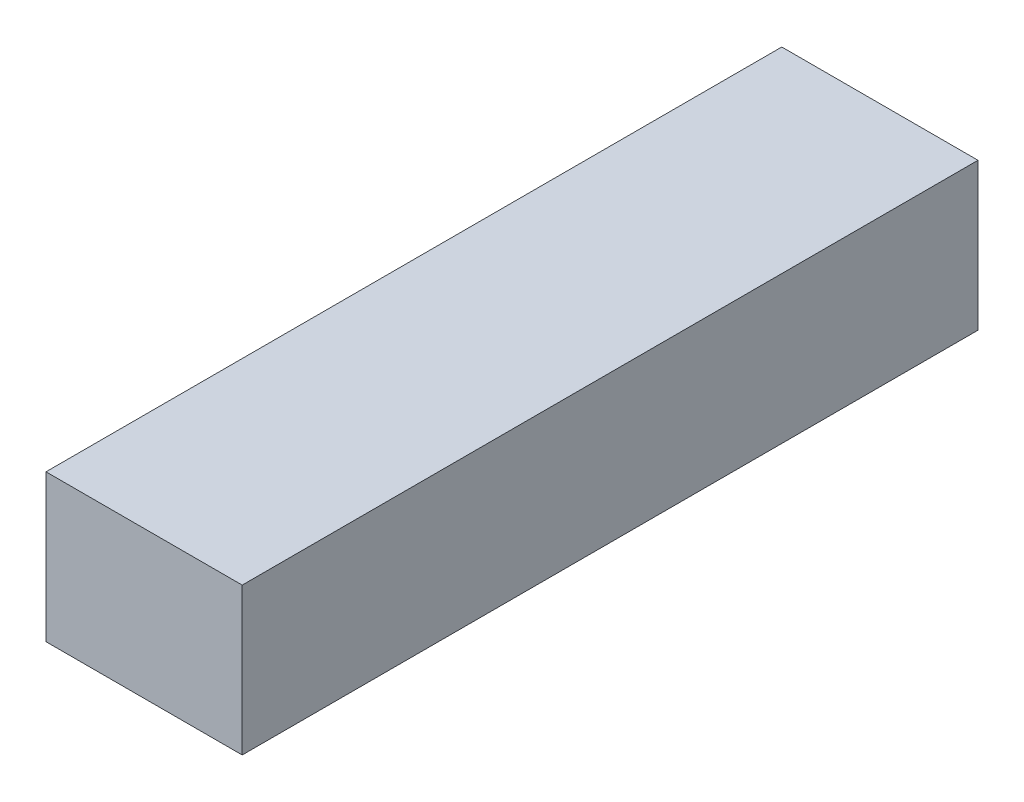
ISO-10303-21;
HEADER;
FILE_DESCRIPTION(('STEP AP214'),'2;1');
FILE_NAME('part.step','',(''),(''),'','','');
FILE_SCHEMA(('AUTOMOTIVE_DESIGN { 1 0 10303 214 1 1 1 1 }'));
ENDSEC;
DATA;
#1=APPLICATION_CONTEXT('core data for automotive mechanical design processes');
#2=APPLICATION_PROTOCOL_DEFINITION('international standard','automotive_design',2000,#1);
#3=PRODUCT_CONTEXT('',#1,'mechanical');
#4=PRODUCT('Part','Part','',(#3));
#5=PRODUCT_RELATED_PRODUCT_CATEGORY('part','',(#4));
#6=PRODUCT_DEFINITION_FORMATION('','',#4);
#7=PRODUCT_DEFINITION_CONTEXT('part definition',#1,'design');
#8=PRODUCT_DEFINITION('design','',#6,#7);
#9=PRODUCT_DEFINITION_SHAPE('','',#8);
#10=(LENGTH_UNIT() NAMED_UNIT(*) SI_UNIT(.MILLI.,.METRE.));
#11=(NAMED_UNIT(*) PLANE_ANGLE_UNIT() SI_UNIT($,.RADIAN.));
#12=(NAMED_UNIT(*) SI_UNIT($,.STERADIAN.) SOLID_ANGLE_UNIT());
#13=UNCERTAINTY_MEASURE_WITH_UNIT(LENGTH_MEASURE(1.E-05),#10,'distance_accuracy_value','');
#14=(GEOMETRIC_REPRESENTATION_CONTEXT(3) GLOBAL_UNCERTAINTY_ASSIGNED_CONTEXT((#13)) GLOBAL_UNIT_ASSIGNED_CONTEXT((#10,
#11,#12)) REPRESENTATION_CONTEXT('',''));
#15=CARTESIAN_POINT('',(0.,0.,0.));
#16=DIRECTION('',(0.,0.,1.));
#17=DIRECTION('',(1.,0.,0.));
#18=AXIS2_PLACEMENT_3D('',#15,#16,#17);
#19=CARTESIAN_POINT('',(0.,6.,30.));
#20=DIRECTION('',(-1.,0.,0.));
#21=DIRECTION('',(0.,-1.,0.));
#22=AXIS2_PLACEMENT_3D('',#19,#20,#21);
#23=PLANE('',#22);
#24=DIRECTION('',(0.,1.,0.));
#25=VECTOR('',#24,1.);
#26=CARTESIAN_POINT('',(0.,6.,0.));
#27=LINE('',#26,#25);
#28=CARTESIAN_POINT('',(0.,0.,0.));
#29=VERTEX_POINT('',#28);
#30=CARTESIAN_POINT('',(0.,6.,0.));
#31=VERTEX_POINT('',#30);
#32=EDGE_CURVE('E96',#29,#31,#27,.T.);
#33=ORIENTED_EDGE('',*,*,#32,.T.);
#34=DIRECTION('',(0.,0.,-1.));
#35=VECTOR('',#34,1.);
#36=CARTESIAN_POINT('',(0.,6.,30.));
#37=LINE('',#36,#35);
#38=CARTESIAN_POINT('',(0.,6.,30.));
#39=VERTEX_POINT('',#38);
#40=EDGE_CURVE('E11',#39,#31,#37,.T.);
#41=ORIENTED_EDGE('',*,*,#40,.F.);
#42=DIRECTION('',(0.,1.,0.));
#43=VECTOR('',#42,1.);
#44=CARTESIAN_POINT('',(0.,6.,30.));
#45=LINE('',#44,#43);
#46=CARTESIAN_POINT('',(0.,0.,30.));
#47=VERTEX_POINT('',#46);
#48=EDGE_CURVE('E84',#47,#39,#45,.T.);
#49=ORIENTED_EDGE('',*,*,#48,.F.);
#50=DIRECTION('',(0.,0.,-1.));
#51=VECTOR('',#50,1.);
#52=CARTESIAN_POINT('',(0.,0.,30.));
#53=LINE('',#52,#51);
#54=EDGE_CURVE('E92',#47,#29,#53,.T.);
#55=ORIENTED_EDGE('',*,*,#54,.T.);
#56=EDGE_LOOP('',(#33,#41,#49,#55));
#57=FACE_BOUND('',#56,.T.);
#58=ADVANCED_FACE('F33',(#57),#23,.F.);
#59=CARTESIAN_POINT('',(-8.,6.,30.));
#60=DIRECTION('',(0.,-1.,0.));
#61=DIRECTION('',(0.,0.,-1.));
#62=AXIS2_PLACEMENT_3D('',#59,#60,#61);
#63=PLANE('',#62);
#64=DIRECTION('',(-1.,0.,0.));
#65=VECTOR('',#64,1.);
#66=CARTESIAN_POINT('',(-8.,6.,0.));
#67=LINE('',#66,#65);
#68=CARTESIAN_POINT('',(-8.,6.,0.));
#69=VERTEX_POINT('',#68);
#70=EDGE_CURVE('E88',#31,#69,#67,.T.);
#71=ORIENTED_EDGE('',*,*,#70,.T.);
#72=DIRECTION('',(0.,0.,-1.));
#73=VECTOR('',#72,1.);
#74=CARTESIAN_POINT('',(-8.,6.,30.));
#75=LINE('',#74,#73);
#76=CARTESIAN_POINT('',(-8.,6.,30.));
#77=VERTEX_POINT('',#76);
#78=EDGE_CURVE('E41',#77,#69,#75,.T.);
#79=ORIENTED_EDGE('',*,*,#78,.F.);
#80=DIRECTION('',(-1.,0.,0.));
#81=VECTOR('',#80,1.);
#82=CARTESIAN_POINT('',(-8.,6.,30.));
#83=LINE('',#82,#81);
#84=EDGE_CURVE('E79',#39,#77,#83,.T.);
#85=ORIENTED_EDGE('',*,*,#84,.F.);
#86=ORIENTED_EDGE('',*,*,#40,.T.);
#87=EDGE_LOOP('',(#71,#79,#85,#86));
#88=FACE_BOUND('',#87,.T.);
#89=ADVANCED_FACE('F87',(#88),#63,.F.);
#90=CARTESIAN_POINT('',(-8.,0.,30.));
#91=DIRECTION('',(1.,0.,0.));
#92=DIRECTION('',(0.,0.,-1.));
#93=AXIS2_PLACEMENT_3D('',#90,#91,#92);
#94=PLANE('',#93);
#95=DIRECTION('',(0.,-1.,0.));
#96=VECTOR('',#95,1.);
#97=CARTESIAN_POINT('',(-8.,0.,0.));
#98=LINE('',#97,#96);
#99=CARTESIAN_POINT('',(-8.,0.,0.));
#100=VERTEX_POINT('',#99);
#101=EDGE_CURVE('E66',#69,#100,#98,.T.);
#102=ORIENTED_EDGE('',*,*,#101,.T.);
#103=DIRECTION('',(0.,0.,-1.));
#104=VECTOR('',#103,1.);
#105=CARTESIAN_POINT('',(-8.,0.,30.));
#106=LINE('',#105,#104);
#107=CARTESIAN_POINT('',(-8.,0.,30.));
#108=VERTEX_POINT('',#107);
#109=EDGE_CURVE('E89',#108,#100,#106,.T.);
#110=ORIENTED_EDGE('',*,*,#109,.F.);
#111=DIRECTION('',(0.,-1.,0.));
#112=VECTOR('',#111,1.);
#113=CARTESIAN_POINT('',(-8.,0.,30.));
#114=LINE('',#113,#112);
#115=EDGE_CURVE('E82',#77,#108,#114,.T.);
#116=ORIENTED_EDGE('',*,*,#115,.F.);
#117=ORIENTED_EDGE('',*,*,#78,.T.);
#118=EDGE_LOOP('',(#102,#110,#116,#117));
#119=FACE_BOUND('',#118,.T.);
#120=ADVANCED_FACE('F90',(#119),#94,.F.);
#121=CARTESIAN_POINT('',(0.,0.,30.));
#122=DIRECTION('',(0.,1.,0.));
#123=DIRECTION('',(0.,0.,1.));
#124=AXIS2_PLACEMENT_3D('',#121,#122,#123);
#125=PLANE('',#124);
#126=DIRECTION('',(1.,0.,0.));
#127=VECTOR('',#126,1.);
#128=CARTESIAN_POINT('',(0.,0.,0.));
#129=LINE('',#128,#127);
#130=EDGE_CURVE('E72',#100,#29,#129,.T.);
#131=ORIENTED_EDGE('',*,*,#130,.T.);
#132=ORIENTED_EDGE('',*,*,#54,.F.);
#133=DIRECTION('',(1.,0.,0.));
#134=VECTOR('',#133,1.);
#135=CARTESIAN_POINT('',(0.,0.,30.));
#136=LINE('',#135,#134);
#137=EDGE_CURVE('E49',#108,#47,#136,.T.);
#138=ORIENTED_EDGE('',*,*,#137,.F.);
#139=ORIENTED_EDGE('',*,*,#109,.T.);
#140=EDGE_LOOP('',(#131,#132,#138,#139));
#141=FACE_BOUND('',#140,.T.);
#142=ADVANCED_FACE('F103',(#141),#125,.F.);
#143=CARTESIAN_POINT('',(0.,0.,30.));
#144=DIRECTION('',(0.,0.,-1.));
#145=DIRECTION('',(-1.,0.,0.));
#146=AXIS2_PLACEMENT_3D('',#143,#144,#145);
#147=PLANE('',#146);
#148=ORIENTED_EDGE('',*,*,#48,.T.);
#149=ORIENTED_EDGE('',*,*,#84,.T.);
#150=ORIENTED_EDGE('',*,*,#115,.T.);
#151=ORIENTED_EDGE('',*,*,#137,.T.);
#152=EDGE_LOOP('',(#148,#149,#150,#151));
#153=FACE_BOUND('',#152,.T.);
#154=ADVANCED_FACE('F80',(#153),#147,.F.);
#155=CARTESIAN_POINT('',(0.,0.,0.));
#156=DIRECTION('',(0.,0.,-1.));
#157=DIRECTION('',(-1.,0.,0.));
#158=AXIS2_PLACEMENT_3D('',#155,#156,#157);
#159=PLANE('',#158);
#160=ORIENTED_EDGE('',*,*,#32,.F.);
#161=ORIENTED_EDGE('',*,*,#130,.F.);
#162=ORIENTED_EDGE('',*,*,#101,.F.);
#163=ORIENTED_EDGE('',*,*,#70,.F.);
#164=EDGE_LOOP('',(#160,#161,#162,#163));
#165=FACE_BOUND('',#164,.T.);
#166=ADVANCED_FACE('F106',(#165),#159,.T.);
#167=CLOSED_SHELL('',(#58,#89,#120,#142,#154,#166));
#168=MANIFOLD_SOLID_BREP('B2',#167);
#169=ADVANCED_BREP_SHAPE_REPRESENTATION('',(#18,#168),#14);
#170=SHAPE_DEFINITION_REPRESENTATION(#9,#169);
ENDSEC;
END-ISO-10303-21;
